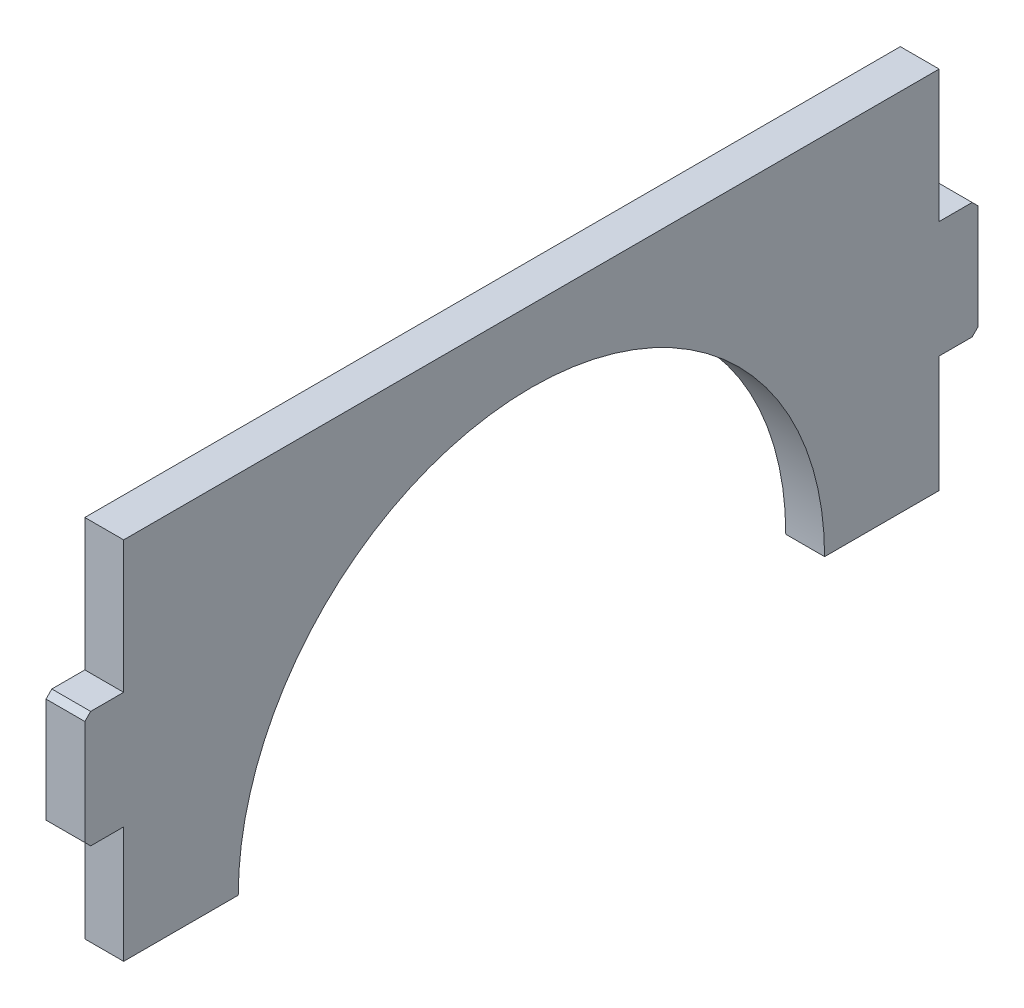
ISO-10303-21;
HEADER;
FILE_DESCRIPTION(('STEP AP214'),'2;1');
FILE_NAME('part.step','',(''),(''),'','','');
FILE_SCHEMA(('AUTOMOTIVE_DESIGN { 1 0 10303 214 1 1 1 1 }'));
ENDSEC;
DATA;
#1=APPLICATION_CONTEXT('core data for automotive mechanical design processes');
#2=APPLICATION_PROTOCOL_DEFINITION('international standard','automotive_design',2000,#1);
#3=PRODUCT_CONTEXT('',#1,'mechanical');
#4=PRODUCT('Part','Part','',(#3));
#5=PRODUCT_RELATED_PRODUCT_CATEGORY('part','',(#4));
#6=PRODUCT_DEFINITION_FORMATION('','',#4);
#7=PRODUCT_DEFINITION_CONTEXT('part definition',#1,'design');
#8=PRODUCT_DEFINITION('design','',#6,#7);
#9=PRODUCT_DEFINITION_SHAPE('','',#8);
#10=(LENGTH_UNIT() NAMED_UNIT(*) SI_UNIT(.MILLI.,.METRE.));
#11=(NAMED_UNIT(*) PLANE_ANGLE_UNIT() SI_UNIT($,.RADIAN.));
#12=(NAMED_UNIT(*) SI_UNIT($,.STERADIAN.) SOLID_ANGLE_UNIT());
#13=UNCERTAINTY_MEASURE_WITH_UNIT(LENGTH_MEASURE(1.E-05),#10,'distance_accuracy_value','');
#14=(GEOMETRIC_REPRESENTATION_CONTEXT(3) GLOBAL_UNCERTAINTY_ASSIGNED_CONTEXT((#13)) GLOBAL_UNIT_ASSIGNED_CONTEXT((#10,
#11,#12)) REPRESENTATION_CONTEXT('',''));
#15=CARTESIAN_POINT('',(0.,0.,0.));
#16=DIRECTION('',(0.,0.,1.));
#17=DIRECTION('',(1.,0.,0.));
#18=AXIS2_PLACEMENT_3D('',#15,#16,#17);
#19=CARTESIAN_POINT('',(5.,0.,-105.));
#20=DIRECTION('',(0.,0.,1.));
#21=DIRECTION('',(1.,0.,0.));
#22=AXIS2_PLACEMENT_3D('',#19,#20,#21);
#23=PLANE('',#22);
#24=DIRECTION('',(-1.,0.,0.));
#25=VECTOR('',#24,1.);
#26=CARTESIAN_POINT('',(5.,30.,-105.));
#27=LINE('',#26,#25);
#28=CARTESIAN_POINT('',(5.,30.,-105.));
#29=VERTEX_POINT('',#28);
#30=CARTESIAN_POINT('',(-5.,30.,-105.));
#31=VERTEX_POINT('',#30);
#32=EDGE_CURVE('E168',#29,#31,#27,.T.);
#33=ORIENTED_EDGE('',*,*,#32,.F.);
#34=DIRECTION('',(0.,1.,0.));
#35=VECTOR('',#34,1.);
#36=CARTESIAN_POINT('',(5.,0.,-105.));
#37=LINE('',#36,#35);
#38=CARTESIAN_POINT('',(5.,0.,-105.));
#39=VERTEX_POINT('',#38);
#40=EDGE_CURVE('E177',#39,#29,#37,.T.);
#41=ORIENTED_EDGE('',*,*,#40,.F.);
#42=DIRECTION('',(-1.,0.,0.));
#43=VECTOR('',#42,1.);
#44=CARTESIAN_POINT('',(5.,0.,-105.));
#45=LINE('',#44,#43);
#46=CARTESIAN_POINT('',(-5.,0.,-105.));
#47=VERTEX_POINT('',#46);
#48=EDGE_CURVE('E229',#39,#47,#45,.T.);
#49=ORIENTED_EDGE('',*,*,#48,.T.);
#50=DIRECTION('',(0.,1.,0.));
#51=VECTOR('',#50,1.);
#52=CARTESIAN_POINT('',(-5.,0.,-105.));
#53=LINE('',#52,#51);
#54=EDGE_CURVE('E179',#47,#31,#53,.T.);
#55=ORIENTED_EDGE('',*,*,#54,.T.);
#56=EDGE_LOOP('',(#33,#41,#49,#55));
#57=FACE_BOUND('',#56,.T.);
#58=ADVANCED_FACE('F41',(#57),#23,.F.);
#59=CARTESIAN_POINT('',(5.,94.,105.));
#60=DIRECTION('',(0.,0.,-1.));
#61=DIRECTION('',(-1.,0.,0.));
#62=AXIS2_PLACEMENT_3D('',#59,#60,#61);
#63=PLANE('',#62);
#64=DIRECTION('',(-1.,0.,0.));
#65=VECTOR('',#64,1.);
#66=CARTESIAN_POINT('',(5.,60.,105.));
#67=LINE('',#66,#65);
#68=CARTESIAN_POINT('',(5.,60.,105.));
#69=VERTEX_POINT('',#68);
#70=CARTESIAN_POINT('',(-5.,60.,105.));
#71=VERTEX_POINT('',#70);
#72=EDGE_CURVE('E205',#69,#71,#67,.T.);
#73=ORIENTED_EDGE('',*,*,#72,.F.);
#74=DIRECTION('',(0.,-1.,0.));
#75=VECTOR('',#74,1.);
#76=CARTESIAN_POINT('',(5.,94.,105.));
#77=LINE('',#76,#75);
#78=CARTESIAN_POINT('',(5.,94.,105.));
#79=VERTEX_POINT('',#78);
#80=EDGE_CURVE('E195',#79,#69,#77,.T.);
#81=ORIENTED_EDGE('',*,*,#80,.F.);
#82=DIRECTION('',(-1.,0.,0.));
#83=VECTOR('',#82,1.);
#84=CARTESIAN_POINT('',(5.,94.,105.));
#85=LINE('',#84,#83);
#86=CARTESIAN_POINT('',(-5.,94.,105.));
#87=VERTEX_POINT('',#86);
#88=EDGE_CURVE('E223',#79,#87,#85,.T.);
#89=ORIENTED_EDGE('',*,*,#88,.T.);
#90=DIRECTION('',(0.,-1.,0.));
#91=VECTOR('',#90,1.);
#92=CARTESIAN_POINT('',(-5.,94.,105.));
#93=LINE('',#92,#91);
#94=EDGE_CURVE('E212',#87,#71,#93,.T.);
#95=ORIENTED_EDGE('',*,*,#94,.T.);
#96=EDGE_LOOP('',(#73,#81,#89,#95));
#97=FACE_BOUND('',#96,.T.);
#98=ADVANCED_FACE('F327',(#97),#63,.F.);
#99=CARTESIAN_POINT('',(5.,0.,0.));
#100=DIRECTION('',(-1.,0.,0.));
#101=DIRECTION('',(0.,0.,1.));
#102=AXIS2_PLACEMENT_3D('',#99,#100,#101);
#103=CYLINDRICAL_SURFACE('',#102,75.5);
#104=CARTESIAN_POINT('',(-5.,0.,0.));
#105=DIRECTION('',(-1.,0.,0.));
#106=DIRECTION('',(0.,0.,1.));
#107=AXIS2_PLACEMENT_3D('',#104,#105,#106);
#108=CIRCLE('',#107,75.5);
#109=CARTESIAN_POINT('',(-5.,0.,75.5));
#110=VERTEX_POINT('',#109);
#111=CARTESIAN_POINT('',(-5.,0.,-75.5));
#112=VERTEX_POINT('',#111);
#113=EDGE_CURVE('E201',#110,#112,#108,.T.);
#114=ORIENTED_EDGE('',*,*,#113,.T.);
#115=DIRECTION('',(-1.,0.,0.));
#116=VECTOR('',#115,1.);
#117=CARTESIAN_POINT('',(5.,0.,-75.5));
#118=LINE('',#117,#116);
#119=CARTESIAN_POINT('',(5.,0.,-75.5));
#120=VERTEX_POINT('',#119);
#121=EDGE_CURVE('E231',#120,#112,#118,.T.);
#122=ORIENTED_EDGE('',*,*,#121,.F.);
#123=CARTESIAN_POINT('',(5.,0.,0.));
#124=DIRECTION('',(-1.,0.,0.));
#125=DIRECTION('',(0.,0.,1.));
#126=AXIS2_PLACEMENT_3D('',#123,#124,#125);
#127=CIRCLE('',#126,75.5);
#128=CARTESIAN_POINT('',(5.,0.,75.5));
#129=VERTEX_POINT('',#128);
#130=EDGE_CURVE('E217',#129,#120,#127,.T.);
#131=ORIENTED_EDGE('',*,*,#130,.F.);
#132=DIRECTION('',(-1.,0.,0.));
#133=VECTOR('',#132,1.);
#134=CARTESIAN_POINT('',(5.,0.,75.5));
#135=LINE('',#134,#133);
#136=EDGE_CURVE('E200',#129,#110,#135,.T.);
#137=ORIENTED_EDGE('',*,*,#136,.T.);
#138=EDGE_LOOP('',(#114,#122,#131,#137));
#139=FACE_BOUND('',#138,.T.);
#140=ADVANCED_FACE('F317',(#139),#103,.F.);
#141=CARTESIAN_POINT('',(5.,0.,-75.5));
#142=DIRECTION('',(0.,1.,0.));
#143=DIRECTION('',(0.,0.,1.));
#144=AXIS2_PLACEMENT_3D('',#141,#142,#143);
#145=PLANE('',#144);
#146=DIRECTION('',(0.,0.,-1.));
#147=VECTOR('',#146,1.);
#148=CARTESIAN_POINT('',(-5.,0.,-75.5));
#149=LINE('',#148,#147);
#150=EDGE_CURVE('E204',#112,#47,#149,.T.);
#151=ORIENTED_EDGE('',*,*,#150,.T.);
#152=ORIENTED_EDGE('',*,*,#48,.F.);
#153=DIRECTION('',(0.,0.,-1.));
#154=VECTOR('',#153,1.);
#155=CARTESIAN_POINT('',(5.,0.,-75.5));
#156=LINE('',#155,#154);
#157=EDGE_CURVE('E185',#120,#39,#156,.T.);
#158=ORIENTED_EDGE('',*,*,#157,.F.);
#159=ORIENTED_EDGE('',*,*,#121,.T.);
#160=EDGE_LOOP('',(#151,#152,#158,#159));
#161=FACE_BOUND('',#160,.T.);
#162=ADVANCED_FACE('F320',(#161),#145,.F.);
#163=CARTESIAN_POINT('',(5.,60.,-105.));
#164=VERTEX_POINT('',#163);
#165=CARTESIAN_POINT('',(5.,94.,-105.));
#166=VERTEX_POINT('',#165);
#167=EDGE_CURVE('E188',#164,#166,#37,.T.);
#168=ORIENTED_EDGE('',*,*,#167,.F.);
#169=DIRECTION('',(-1.,0.,0.));
#170=VECTOR('',#169,1.);
#171=CARTESIAN_POINT('',(5.,60.,-105.));
#172=LINE('',#171,#170);
#173=CARTESIAN_POINT('',(-5.,60.,-105.));
#174=VERTEX_POINT('',#173);
#175=EDGE_CURVE('E181',#164,#174,#172,.T.);
#176=ORIENTED_EDGE('',*,*,#175,.T.);
#177=CARTESIAN_POINT('',(-5.,94.,-105.));
#178=VERTEX_POINT('',#177);
#179=EDGE_CURVE('E207',#174,#178,#53,.T.);
#180=ORIENTED_EDGE('',*,*,#179,.T.);
#181=DIRECTION('',(-1.,0.,0.));
#182=VECTOR('',#181,1.);
#183=CARTESIAN_POINT('',(5.,94.,-105.));
#184=LINE('',#183,#182);
#185=EDGE_CURVE('E226',#166,#178,#184,.T.);
#186=ORIENTED_EDGE('',*,*,#185,.F.);
#187=EDGE_LOOP('',(#168,#176,#180,#186));
#188=FACE_BOUND('',#187,.T.);
#189=ADVANCED_FACE('F329',(#188),#23,.F.);
#190=CARTESIAN_POINT('',(5.,94.,-105.));
#191=DIRECTION('',(0.,-1.,0.));
#192=DIRECTION('',(0.,0.,-1.));
#193=AXIS2_PLACEMENT_3D('',#190,#191,#192);
#194=PLANE('',#193);
#195=DIRECTION('',(0.,0.,1.));
#196=VECTOR('',#195,1.);
#197=CARTESIAN_POINT('',(-5.,94.,-105.));
#198=LINE('',#197,#196);
#199=EDGE_CURVE('E209',#178,#87,#198,.T.);
#200=ORIENTED_EDGE('',*,*,#199,.T.);
#201=ORIENTED_EDGE('',*,*,#88,.F.);
#202=DIRECTION('',(0.,0.,1.));
#203=VECTOR('',#202,1.);
#204=CARTESIAN_POINT('',(5.,94.,-105.));
#205=LINE('',#204,#203);
#206=EDGE_CURVE('E187',#166,#79,#205,.T.);
#207=ORIENTED_EDGE('',*,*,#206,.F.);
#208=ORIENTED_EDGE('',*,*,#185,.T.);
#209=EDGE_LOOP('',(#200,#201,#207,#208));
#210=FACE_BOUND('',#209,.T.);
#211=ADVANCED_FACE('F340',(#210),#194,.F.);
#212=CARTESIAN_POINT('',(5.,30.,105.));
#213=VERTEX_POINT('',#212);
#214=CARTESIAN_POINT('',(5.,0.,105.));
#215=VERTEX_POINT('',#214);
#216=EDGE_CURVE('E190',#213,#215,#77,.T.);
#217=ORIENTED_EDGE('',*,*,#216,.F.);
#218=DIRECTION('',(-1.,0.,0.));
#219=VECTOR('',#218,1.);
#220=CARTESIAN_POINT('',(5.,30.,105.));
#221=LINE('',#220,#219);
#222=CARTESIAN_POINT('',(-5.,30.,105.));
#223=VERTEX_POINT('',#222);
#224=EDGE_CURVE('E302',#213,#223,#221,.T.);
#225=ORIENTED_EDGE('',*,*,#224,.T.);
#226=CARTESIAN_POINT('',(-5.,0.,105.));
#227=VERTEX_POINT('',#226);
#228=EDGE_CURVE('E211',#223,#227,#93,.T.);
#229=ORIENTED_EDGE('',*,*,#228,.T.);
#230=DIRECTION('',(-1.,0.,0.));
#231=VECTOR('',#230,1.);
#232=CARTESIAN_POINT('',(5.,0.,105.));
#233=LINE('',#232,#231);
#234=EDGE_CURVE('E220',#215,#227,#233,.T.);
#235=ORIENTED_EDGE('',*,*,#234,.F.);
#236=EDGE_LOOP('',(#217,#225,#229,#235));
#237=FACE_BOUND('',#236,.T.);
#238=ADVANCED_FACE('F337',(#237),#63,.F.);
#239=CARTESIAN_POINT('',(5.,0.,105.));
#240=DIRECTION('',(0.,1.,0.));
#241=DIRECTION('',(0.,0.,1.));
#242=AXIS2_PLACEMENT_3D('',#239,#240,#241);
#243=PLANE('',#242);
#244=DIRECTION('',(0.,0.,-1.));
#245=VECTOR('',#244,1.);
#246=CARTESIAN_POINT('',(-5.,0.,105.));
#247=LINE('',#246,#245);
#248=EDGE_CURVE('E215',#227,#110,#247,.T.);
#249=ORIENTED_EDGE('',*,*,#248,.T.);
#250=ORIENTED_EDGE('',*,*,#136,.F.);
#251=DIRECTION('',(0.,0.,-1.));
#252=VECTOR('',#251,1.);
#253=CARTESIAN_POINT('',(5.,0.,105.));
#254=LINE('',#253,#252);
#255=EDGE_CURVE('E198',#215,#129,#254,.T.);
#256=ORIENTED_EDGE('',*,*,#255,.F.);
#257=ORIENTED_EDGE('',*,*,#234,.T.);
#258=EDGE_LOOP('',(#249,#250,#256,#257));
#259=FACE_BOUND('',#258,.T.);
#260=ADVANCED_FACE('F382',(#259),#243,.F.);
#261=CARTESIAN_POINT('',(5.,0.,0.));
#262=DIRECTION('',(-1.,0.,0.));
#263=DIRECTION('',(0.,0.,1.));
#264=AXIS2_PLACEMENT_3D('',#261,#262,#263);
#265=PLANE('',#264);
#266=DIRECTION('',(0.,-1.,0.));
#267=VECTOR('',#266,1.);
#268=CARTESIAN_POINT('',(5.,30.,-115.));
#269=LINE('',#268,#267);
#270=CARTESIAN_POINT('',(5.,58.5,-115.));
#271=VERTEX_POINT('',#270);
#272=CARTESIAN_POINT('',(5.,31.5,-115.));
#273=VERTEX_POINT('',#272);
#274=EDGE_CURVE('E171',#271,#273,#269,.T.);
#275=ORIENTED_EDGE('',*,*,#274,.F.);
#276=DIRECTION('',(0.,-0.707106781186541,-0.707106781186554));
#277=VECTOR('',#276,1.);
#278=CARTESIAN_POINT('',(5.,60.,-113.5));
#279=LINE('',#278,#277);
#280=CARTESIAN_POINT('',(5.,60.,-113.5));
#281=VERTEX_POINT('',#280);
#282=EDGE_CURVE('E50',#271,#281,#279,.F.);
#283=ORIENTED_EDGE('',*,*,#282,.T.);
#284=DIRECTION('',(0.,0.,-1.));
#285=VECTOR('',#284,1.);
#286=CARTESIAN_POINT('',(5.,60.,-115.));
#287=LINE('',#286,#285);
#288=EDGE_CURVE('E267',#164,#281,#287,.T.);
#289=ORIENTED_EDGE('',*,*,#288,.F.);
#290=ORIENTED_EDGE('',*,*,#167,.T.);
#291=ORIENTED_EDGE('',*,*,#206,.T.);
#292=ORIENTED_EDGE('',*,*,#80,.T.);
#293=DIRECTION('',(0.,0.,1.));
#294=VECTOR('',#293,1.);
#295=CARTESIAN_POINT('',(5.,60.,115.));
#296=LINE('',#295,#294);
#297=CARTESIAN_POINT('',(5.,60.,113.5));
#298=VERTEX_POINT('',#297);
#299=EDGE_CURVE('E293',#69,#298,#296,.T.);
#300=ORIENTED_EDGE('',*,*,#299,.T.);
#301=DIRECTION('',(0.,0.707106781186548,-0.707106781186548));
#302=VECTOR('',#301,1.);
#303=CARTESIAN_POINT('',(5.,58.5,115.));
#304=LINE('',#303,#302);
#305=CARTESIAN_POINT('',(5.,58.5,115.));
#306=VERTEX_POINT('',#305);
#307=EDGE_CURVE('E247',#298,#306,#304,.F.);
#308=ORIENTED_EDGE('',*,*,#307,.T.);
#309=DIRECTION('',(0.,-1.,0.));
#310=VECTOR('',#309,1.);
#311=CARTESIAN_POINT('',(5.,30.,115.));
#312=LINE('',#311,#310);
#313=CARTESIAN_POINT('',(5.,31.5,115.));
#314=VERTEX_POINT('',#313);
#315=EDGE_CURVE('E296',#306,#314,#312,.T.);
#316=ORIENTED_EDGE('',*,*,#315,.T.);
#317=DIRECTION('',(0.,0.707106781186548,0.707106781186548));
#318=VECTOR('',#317,1.);
#319=CARTESIAN_POINT('',(5.,30.,113.5));
#320=LINE('',#319,#318);
#321=CARTESIAN_POINT('',(5.,30.,113.5));
#322=VERTEX_POINT('',#321);
#323=EDGE_CURVE('E245',#314,#322,#320,.F.);
#324=ORIENTED_EDGE('',*,*,#323,.T.);
#325=DIRECTION('',(0.,0.,-1.));
#326=VECTOR('',#325,1.);
#327=CARTESIAN_POINT('',(5.,30.,105.));
#328=LINE('',#327,#326);
#329=EDGE_CURVE('E300',#322,#213,#328,.T.);
#330=ORIENTED_EDGE('',*,*,#329,.T.);
#331=ORIENTED_EDGE('',*,*,#216,.T.);
#332=ORIENTED_EDGE('',*,*,#255,.T.);
#333=ORIENTED_EDGE('',*,*,#130,.T.);
#334=ORIENTED_EDGE('',*,*,#157,.T.);
#335=ORIENTED_EDGE('',*,*,#40,.T.);
#336=DIRECTION('',(0.,0.,1.));
#337=VECTOR('',#336,1.);
#338=CARTESIAN_POINT('',(5.,30.,-105.));
#339=LINE('',#338,#337);
#340=CARTESIAN_POINT('',(5.,30.,-113.5));
#341=VERTEX_POINT('',#340);
#342=EDGE_CURVE('E165',#341,#29,#339,.T.);
#343=ORIENTED_EDGE('',*,*,#342,.F.);
#344=DIRECTION('',(0.,-0.707106781186548,0.707106781186548));
#345=VECTOR('',#344,1.);
#346=CARTESIAN_POINT('',(5.,31.5,-115.));
#347=LINE('',#346,#345);
#348=EDGE_CURVE('E62',#341,#273,#347,.F.);
#349=ORIENTED_EDGE('',*,*,#348,.T.);
#350=EDGE_LOOP('',(#275,#283,#289,#290,#291,#292,#300,#308,#316,#324,#330,#331,#332,#333,#334,
#335,#343,#349));
#351=FACE_BOUND('',#350,.T.);
#352=ADVANCED_FACE('F183',(#351),#265,.F.);
#353=CARTESIAN_POINT('',(-5.,0.,0.));
#354=DIRECTION('',(-1.,0.,0.));
#355=DIRECTION('',(0.,0.,1.));
#356=AXIS2_PLACEMENT_3D('',#353,#354,#355);
#357=PLANE('',#356);
#358=DIRECTION('',(0.,0.,-1.));
#359=VECTOR('',#358,1.);
#360=CARTESIAN_POINT('',(-5.,60.,-115.));
#361=LINE('',#360,#359);
#362=CARTESIAN_POINT('',(-5.,60.,-113.5));
#363=VERTEX_POINT('',#362);
#364=EDGE_CURVE('E172',#174,#363,#361,.T.);
#365=ORIENTED_EDGE('',*,*,#364,.T.);
#366=DIRECTION('',(0.,0.707106781186541,0.707106781186554));
#367=VECTOR('',#366,1.);
#368=CARTESIAN_POINT('',(-5.,86.7500000000005,-86.7499999999989));
#369=LINE('',#368,#367);
#370=CARTESIAN_POINT('',(-5.,58.5,-115.));
#371=VERTEX_POINT('',#370);
#372=EDGE_CURVE('E257',#363,#371,#369,.F.);
#373=ORIENTED_EDGE('',*,*,#372,.T.);
#374=DIRECTION('',(0.,-1.,0.));
#375=VECTOR('',#374,1.);
#376=CARTESIAN_POINT('',(-5.,30.,-115.));
#377=LINE('',#376,#375);
#378=CARTESIAN_POINT('',(-5.,31.5,-115.));
#379=VERTEX_POINT('',#378);
#380=EDGE_CURVE('E282',#371,#379,#377,.T.);
#381=ORIENTED_EDGE('',*,*,#380,.T.);
#382=DIRECTION('',(0.,0.707106781186548,-0.707106781186548));
#383=VECTOR('',#382,1.);
#384=CARTESIAN_POINT('',(-5.,-41.75,-41.75));
#385=LINE('',#384,#383);
#386=CARTESIAN_POINT('',(-5.,30.,-113.5));
#387=VERTEX_POINT('',#386);
#388=EDGE_CURVE('E255',#379,#387,#385,.F.);
#389=ORIENTED_EDGE('',*,*,#388,.T.);
#390=DIRECTION('',(0.,0.,1.));
#391=VECTOR('',#390,1.);
#392=CARTESIAN_POINT('',(-5.,30.,-105.));
#393=LINE('',#392,#391);
#394=EDGE_CURVE('E287',#387,#31,#393,.T.);
#395=ORIENTED_EDGE('',*,*,#394,.T.);
#396=ORIENTED_EDGE('',*,*,#54,.F.);
#397=ORIENTED_EDGE('',*,*,#150,.F.);
#398=ORIENTED_EDGE('',*,*,#113,.F.);
#399=ORIENTED_EDGE('',*,*,#248,.F.);
#400=ORIENTED_EDGE('',*,*,#228,.F.);
#401=DIRECTION('',(0.,0.,-1.));
#402=VECTOR('',#401,1.);
#403=CARTESIAN_POINT('',(-5.,30.,105.));
#404=LINE('',#403,#402);
#405=CARTESIAN_POINT('',(-5.,30.,113.5));
#406=VERTEX_POINT('',#405);
#407=EDGE_CURVE('E297',#406,#223,#404,.T.);
#408=ORIENTED_EDGE('',*,*,#407,.F.);
#409=DIRECTION('',(0.,-0.707106781186548,-0.707106781186548));
#410=VECTOR('',#409,1.);
#411=CARTESIAN_POINT('',(-5.,-41.75,41.75));
#412=LINE('',#411,#410);
#413=CARTESIAN_POINT('',(-5.,31.5,115.));
#414=VERTEX_POINT('',#413);
#415=EDGE_CURVE('E239',#406,#414,#412,.F.);
#416=ORIENTED_EDGE('',*,*,#415,.T.);
#417=DIRECTION('',(0.,-1.,0.));
#418=VECTOR('',#417,1.);
#419=CARTESIAN_POINT('',(-5.,30.,115.));
#420=LINE('',#419,#418);
#421=CARTESIAN_POINT('',(-5.,58.5,115.));
#422=VERTEX_POINT('',#421);
#423=EDGE_CURVE('E305',#422,#414,#420,.T.);
#424=ORIENTED_EDGE('',*,*,#423,.F.);
#425=DIRECTION('',(0.,-0.707106781186548,0.707106781186548));
#426=VECTOR('',#425,1.);
#427=CARTESIAN_POINT('',(-5.,86.75,86.75));
#428=LINE('',#427,#426);
#429=CARTESIAN_POINT('',(-5.,60.,113.5));
#430=VERTEX_POINT('',#429);
#431=EDGE_CURVE('E241',#422,#430,#428,.F.);
#432=ORIENTED_EDGE('',*,*,#431,.T.);
#433=DIRECTION('',(0.,0.,1.));
#434=VECTOR('',#433,1.);
#435=CARTESIAN_POINT('',(-5.,60.,115.));
#436=LINE('',#435,#434);
#437=EDGE_CURVE('E180',#71,#430,#436,.T.);
#438=ORIENTED_EDGE('',*,*,#437,.F.);
#439=ORIENTED_EDGE('',*,*,#94,.F.);
#440=ORIENTED_EDGE('',*,*,#199,.F.);
#441=ORIENTED_EDGE('',*,*,#179,.F.);
#442=EDGE_LOOP('',(#365,#373,#381,#389,#395,#396,#397,#398,#399,#400,#408,#416,#424,#432,#438,
#439,#440,#441));
#443=FACE_BOUND('',#442,.T.);
#444=ADVANCED_FACE('F281',(#443),#357,.T.);
#445=CARTESIAN_POINT('',(5.,60.,115.));
#446=DIRECTION('',(0.,-1.,0.));
#447=DIRECTION('',(0.,0.,-1.));
#448=AXIS2_PLACEMENT_3D('',#445,#446,#447);
#449=PLANE('',#448);
#450=ORIENTED_EDGE('',*,*,#437,.T.);
#451=DIRECTION('',(1.,0.,0.));
#452=VECTOR('',#451,1.);
#453=CARTESIAN_POINT('',(5.,60.,113.5));
#454=LINE('',#453,#452);
#455=EDGE_CURVE('E243',#430,#298,#454,.T.);
#456=ORIENTED_EDGE('',*,*,#455,.T.);
#457=ORIENTED_EDGE('',*,*,#299,.F.);
#458=ORIENTED_EDGE('',*,*,#72,.T.);
#459=EDGE_LOOP('',(#450,#456,#457,#458));
#460=FACE_BOUND('',#459,.T.);
#461=ADVANCED_FACE('F356',(#460),#449,.F.);
#462=CARTESIAN_POINT('',(5.,30.,115.));
#463=DIRECTION('',(0.,0.,-1.));
#464=DIRECTION('',(-1.,0.,0.));
#465=AXIS2_PLACEMENT_3D('',#462,#463,#464);
#466=PLANE('',#465);
#467=ORIENTED_EDGE('',*,*,#315,.F.);
#468=DIRECTION('',(-1.,0.,0.));
#469=VECTOR('',#468,1.);
#470=CARTESIAN_POINT('',(5.,58.5,115.));
#471=LINE('',#470,#469);
#472=EDGE_CURVE('E236',#306,#422,#471,.T.);
#473=ORIENTED_EDGE('',*,*,#472,.T.);
#474=ORIENTED_EDGE('',*,*,#423,.T.);
#475=DIRECTION('',(1.,0.,0.));
#476=VECTOR('',#475,1.);
#477=CARTESIAN_POINT('',(5.,31.5,115.));
#478=LINE('',#477,#476);
#479=EDGE_CURVE('E234',#414,#314,#478,.T.);
#480=ORIENTED_EDGE('',*,*,#479,.T.);
#481=EDGE_LOOP('',(#467,#473,#474,#480));
#482=FACE_BOUND('',#481,.T.);
#483=ADVANCED_FACE('F365',(#482),#466,.F.);
#484=CARTESIAN_POINT('',(5.,30.,105.));
#485=DIRECTION('',(0.,1.,0.));
#486=DIRECTION('',(0.,0.,1.));
#487=AXIS2_PLACEMENT_3D('',#484,#485,#486);
#488=PLANE('',#487);
#489=ORIENTED_EDGE('',*,*,#329,.F.);
#490=DIRECTION('',(-1.,0.,0.));
#491=VECTOR('',#490,1.);
#492=CARTESIAN_POINT('',(5.,30.,113.5));
#493=LINE('',#492,#491);
#494=EDGE_CURVE('E249',#322,#406,#493,.T.);
#495=ORIENTED_EDGE('',*,*,#494,.T.);
#496=ORIENTED_EDGE('',*,*,#407,.T.);
#497=ORIENTED_EDGE('',*,*,#224,.F.);
#498=EDGE_LOOP('',(#489,#495,#496,#497));
#499=FACE_BOUND('',#498,.T.);
#500=ADVANCED_FACE('F375',(#499),#488,.F.);
#501=CARTESIAN_POINT('',(5.,58.5,115.));
#502=DIRECTION('',(0.,-0.707106781186547,-0.707106781186547));
#503=DIRECTION('',(-1.,0.,0.));
#504=AXIS2_PLACEMENT_3D('',#501,#502,#503);
#505=PLANE('',#504);
#506=ORIENTED_EDGE('',*,*,#307,.F.);
#507=ORIENTED_EDGE('',*,*,#455,.F.);
#508=ORIENTED_EDGE('',*,*,#431,.F.);
#509=ORIENTED_EDGE('',*,*,#472,.F.);
#510=EDGE_LOOP('',(#506,#507,#508,#509));
#511=FACE_BOUND('',#510,.T.);
#512=ADVANCED_FACE('F362',(#511),#505,.F.);
#513=CARTESIAN_POINT('',(5.,30.,113.5));
#514=DIRECTION('',(0.,0.707106781186547,-0.707106781186547));
#515=DIRECTION('',(-1.,0.,0.));
#516=AXIS2_PLACEMENT_3D('',#513,#514,#515);
#517=PLANE('',#516);
#518=ORIENTED_EDGE('',*,*,#323,.F.);
#519=ORIENTED_EDGE('',*,*,#479,.F.);
#520=ORIENTED_EDGE('',*,*,#415,.F.);
#521=ORIENTED_EDGE('',*,*,#494,.F.);
#522=EDGE_LOOP('',(#518,#519,#520,#521));
#523=FACE_BOUND('',#522,.T.);
#524=ADVANCED_FACE('F372',(#523),#517,.F.);
#525=CARTESIAN_POINT('',(5.,30.,-105.));
#526=DIRECTION('',(0.,-1.,0.));
#527=DIRECTION('',(0.,0.,-1.));
#528=AXIS2_PLACEMENT_3D('',#525,#526,#527);
#529=PLANE('',#528);
#530=ORIENTED_EDGE('',*,*,#394,.F.);
#531=DIRECTION('',(1.,0.,0.));
#532=VECTOR('',#531,1.);
#533=CARTESIAN_POINT('',(5.,30.,-113.5));
#534=LINE('',#533,#532);
#535=EDGE_CURVE('E11',#387,#341,#534,.T.);
#536=ORIENTED_EDGE('',*,*,#535,.T.);
#537=ORIENTED_EDGE('',*,*,#342,.T.);
#538=ORIENTED_EDGE('',*,*,#32,.T.);
#539=EDGE_LOOP('',(#530,#536,#537,#538));
#540=FACE_BOUND('',#539,.T.);
#541=ADVANCED_FACE('F167',(#540),#529,.T.);
#542=CARTESIAN_POINT('',(5.,30.,-115.));
#543=DIRECTION('',(0.,0.,-1.));
#544=DIRECTION('',(-1.,0.,0.));
#545=AXIS2_PLACEMENT_3D('',#542,#543,#544);
#546=PLANE('',#545);
#547=ORIENTED_EDGE('',*,*,#380,.F.);
#548=DIRECTION('',(1.,0.,0.));
#549=VECTOR('',#548,1.);
#550=CARTESIAN_POINT('',(5.,58.5,-115.));
#551=LINE('',#550,#549);
#552=EDGE_CURVE('E262',#371,#271,#551,.T.);
#553=ORIENTED_EDGE('',*,*,#552,.T.);
#554=ORIENTED_EDGE('',*,*,#274,.T.);
#555=DIRECTION('',(-1.,0.,0.));
#556=VECTOR('',#555,1.);
#557=CARTESIAN_POINT('',(5.,31.5,-115.));
#558=LINE('',#557,#556);
#559=EDGE_CURVE('E259',#273,#379,#558,.T.);
#560=ORIENTED_EDGE('',*,*,#559,.T.);
#561=EDGE_LOOP('',(#547,#553,#554,#560));
#562=FACE_BOUND('',#561,.T.);
#563=ADVANCED_FACE('F285',(#562),#546,.T.);
#564=CARTESIAN_POINT('',(5.,60.,-115.));
#565=DIRECTION('',(0.,1.,0.));
#566=DIRECTION('',(0.,0.,1.));
#567=AXIS2_PLACEMENT_3D('',#564,#565,#566);
#568=PLANE('',#567);
#569=ORIENTED_EDGE('',*,*,#288,.T.);
#570=DIRECTION('',(-1.,0.,0.));
#571=VECTOR('',#570,1.);
#572=CARTESIAN_POINT('',(5.,60.,-113.5));
#573=LINE('',#572,#571);
#574=EDGE_CURVE('E252',#281,#363,#573,.T.);
#575=ORIENTED_EDGE('',*,*,#574,.T.);
#576=ORIENTED_EDGE('',*,*,#364,.F.);
#577=ORIENTED_EDGE('',*,*,#175,.F.);
#578=EDGE_LOOP('',(#569,#575,#576,#577));
#579=FACE_BOUND('',#578,.T.);
#580=ADVANCED_FACE('F273',(#579),#568,.T.);
#581=CARTESIAN_POINT('',(5.,60.,-113.5));
#582=DIRECTION('',(0.,-0.707106781186554,0.707106781186541));
#583=DIRECTION('',(-1.,0.,0.));
#584=AXIS2_PLACEMENT_3D('',#581,#582,#583);
#585=PLANE('',#584);
#586=ORIENTED_EDGE('',*,*,#282,.F.);
#587=ORIENTED_EDGE('',*,*,#552,.F.);
#588=ORIENTED_EDGE('',*,*,#372,.F.);
#589=ORIENTED_EDGE('',*,*,#574,.F.);
#590=EDGE_LOOP('',(#586,#587,#588,#589));
#591=FACE_BOUND('',#590,.T.);
#592=ADVANCED_FACE('F277',(#591),#585,.F.);
#593=CARTESIAN_POINT('',(5.,31.5,-115.));
#594=DIRECTION('',(0.,0.707106781186548,0.707106781186548));
#595=DIRECTION('',(-1.,0.,0.));
#596=AXIS2_PLACEMENT_3D('',#593,#594,#595);
#597=PLANE('',#596);
#598=ORIENTED_EDGE('',*,*,#348,.F.);
#599=ORIENTED_EDGE('',*,*,#535,.F.);
#600=ORIENTED_EDGE('',*,*,#388,.F.);
#601=ORIENTED_EDGE('',*,*,#559,.F.);
#602=EDGE_LOOP('',(#598,#599,#600,#601));
#603=FACE_BOUND('',#602,.T.);
#604=ADVANCED_FACE('F44',(#603),#597,.F.);
#605=CLOSED_SHELL('',(#58,#98,#140,#162,#189,#211,#238,#260,#352,#444,#461,#483,#500,#512,#524,
#541,#563,#580,#592,#604));
#606=MANIFOLD_SOLID_BREP('B2',#605);
#607=ADVANCED_BREP_SHAPE_REPRESENTATION('',(#18,#606),#14);
#608=SHAPE_DEFINITION_REPRESENTATION(#9,#607);
ENDSEC;
END-ISO-10303-21;
